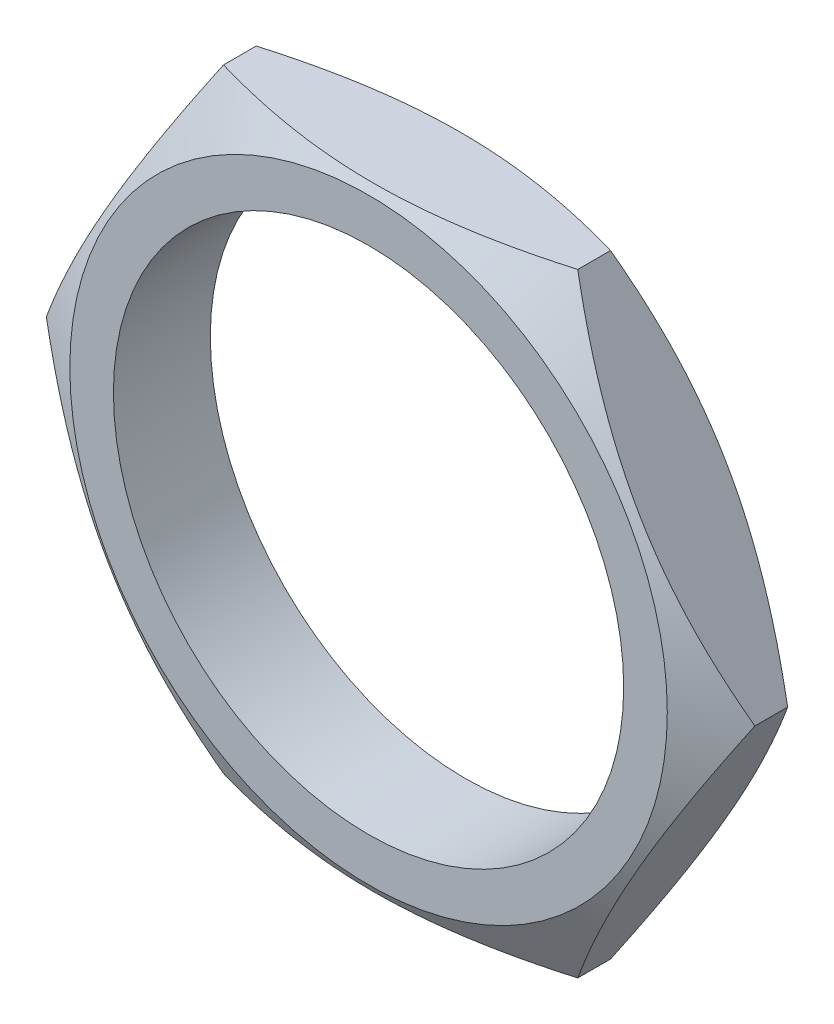
ISO-10303-21;
HEADER;
FILE_DESCRIPTION(('STEP AP214'),'2;1');
FILE_NAME('part.step','',(''),(''),'','','');
FILE_SCHEMA(('AUTOMOTIVE_DESIGN { 1 0 10303 214 1 1 1 1 }'));
ENDSEC;
DATA;
#1=APPLICATION_CONTEXT('core data for automotive mechanical design processes');
#2=APPLICATION_PROTOCOL_DEFINITION('international standard','automotive_design',2000,#1);
#3=PRODUCT_CONTEXT('',#1,'mechanical');
#4=PRODUCT('Part','Part','',(#3));
#5=PRODUCT_RELATED_PRODUCT_CATEGORY('part','',(#4));
#6=PRODUCT_DEFINITION_FORMATION('','',#4);
#7=PRODUCT_DEFINITION_CONTEXT('part definition',#1,'design');
#8=PRODUCT_DEFINITION('design','',#6,#7);
#9=PRODUCT_DEFINITION_SHAPE('','',#8);
#10=(LENGTH_UNIT() NAMED_UNIT(*) SI_UNIT(.MILLI.,.METRE.));
#11=(NAMED_UNIT(*) PLANE_ANGLE_UNIT() SI_UNIT($,.RADIAN.));
#12=(NAMED_UNIT(*) SI_UNIT($,.STERADIAN.) SOLID_ANGLE_UNIT());
#13=UNCERTAINTY_MEASURE_WITH_UNIT(LENGTH_MEASURE(1.E-05),#10,'distance_accuracy_value','');
#14=(GEOMETRIC_REPRESENTATION_CONTEXT(3) GLOBAL_UNCERTAINTY_ASSIGNED_CONTEXT((#13)) GLOBAL_UNIT_ASSIGNED_CONTEXT((#10,
#11,#12)) REPRESENTATION_CONTEXT('',''));
#15=CARTESIAN_POINT('',(0.,0.,0.));
#16=DIRECTION('',(0.,0.,1.));
#17=DIRECTION('',(1.,0.,0.));
#18=AXIS2_PLACEMENT_3D('',#15,#16,#17);
#19=CARTESIAN_POINT('',(5.48482755730136,9.50000000000006,1.5));
#20=DIRECTION('',(0.,-1.,0.));
#21=DIRECTION('',(1.,0.,0.));
#22=AXIS2_PLACEMENT_3D('',#19,#20,#21);
#23=PLANE('',#22);
#24=CARTESIAN_POINT('',(-5.48482747069538,9.49999999999994,-0.507156681671752));
#25=CARTESIAN_POINT('',(-5.24369241217304,9.49999999999994,-0.576752926627082));
#26=CARTESIAN_POINT('',(-5.00165827848154,9.49999999999995,-0.643190232697004));
#27=CARTESIAN_POINT('',(-4.5156491006031,9.49999999999995,-0.768870484568428));
#28=CARTESIAN_POINT('',(-4.27167344600815,9.49999999999995,-0.828111064169221));
#29=CARTESIAN_POINT('',(-3.5358154853058,9.49999999999996,-0.993891189251453));
#30=CARTESIAN_POINT('',(-3.04102834589159,9.49999999999997,-1.08818506270426));
#31=CARTESIAN_POINT('',(-2.30060208487663,9.49999999999998,-1.19875147244339));
#32=CARTESIAN_POINT('',(-2.05717488713435,9.49999999999998,-1.2302473008193));
#33=CARTESIAN_POINT('',(-1.56919354672236,9.49999999999998,-1.28306285329731));
#34=CARTESIAN_POINT('',(-1.32463938245008,9.49999999999999,-1.30438238150603));
#35=CARTESIAN_POINT('',(-0.835123219481101,9.49999999999999,-1.33629907616487));
#36=CARTESIAN_POINT('',(-0.590162053474965,9.49999999999999,-1.34690898339971));
#37=CARTESIAN_POINT('',(-0.100013578709532,9.5,-1.35718099378027));
#38=CARTESIAN_POINT('',(0.145173722826755,9.5,-1.35684343526236));
#39=CARTESIAN_POINT('',(0.603542324034616,9.50000000000001,-1.34598288198209));
#40=CARTESIAN_POINT('',(0.816756005152166,9.50000000000001,-1.33678473937644));
#41=CARTESIAN_POINT('',(1.24268468603248,9.50000000000001,-1.31028846872389));
#42=CARTESIAN_POINT('',(1.45539964945816,9.50000000000002,-1.29298976783103));
#43=CARTESIAN_POINT('',(2.09272028031947,9.50000000000002,-1.22935175402461));
#44=CARTESIAN_POINT('',(2.51619788692956,9.50000000000003,-1.17127845934866));
#45=CARTESIAN_POINT('',(3.36764458045082,9.50000000000004,-1.02609722813325));
#46=CARTESIAN_POINT('',(3.79550502607017,9.50000000000004,-0.938373999348496));
#47=CARTESIAN_POINT('',(4.644846159175,9.50000000000005,-0.739279671614696));
#48=CARTESIAN_POINT('',(5.06633771943659,9.50000000000005,-0.627955321332633));
#49=CARTESIAN_POINT('',(5.48482747069519,9.50000000000006,-0.50715668167175));
#50=B_SPLINE_CURVE_WITH_KNOTS('',3,(#24,#25,#26,#27,#28,#29,#30,#31,#32,#33,#34,#35,#36,#37,#38,
#39,#40,#41,#42,#43,#44,#45,#46,#47,#48,#49),.UNSPECIFIED.,.F.,.F.,(4,2,2,2,2,2,2,2,2,2,2,2,4),
(0.,0.752872599265493,1.50599206823814,3.01543663812971,3.75163414868368,4.48784583043896,
5.22318063625757,5.95849271624439,6.59856919664444,7.23869094807523,8.51984386262599,
9.82940660837379,11.1363992354911),.UNSPECIFIED.);
#51=CARTESIAN_POINT('',(-5.48482754897384,9.50000001442397,-0.507156651862693));
#52=VERTEX_POINT('',#51);
#53=CARTESIAN_POINT('',(5.48482751399828,9.50000000000006,-0.507156669171226));
#54=VERTEX_POINT('',#53);
#55=EDGE_CURVE('E171',#52,#54,#50,.T.);
#56=ORIENTED_EDGE('',*,*,#55,.F.);
#57=DIRECTION('',(0.,0.,1.));
#58=VECTOR('',#57,1.);
#59=CARTESIAN_POINT('',(-5.48482755730156,9.49999999999994,1.5));
#60=LINE('',#59,#58);
#61=CARTESIAN_POINT('',(-5.484827573957,9.49999999999994,0.507156651862692));
#62=VERTEX_POINT('',#61);
#63=EDGE_CURVE('E73',#52,#62,#60,.T.);
#64=ORIENTED_EDGE('',*,*,#63,.T.);
#65=CARTESIAN_POINT('',(5.48482759061223,9.50000000000006,0.507156647054684));
#66=CARTESIAN_POINT('',(5.24369253108016,9.50000000000006,0.57675289344235));
#67=CARTESIAN_POINT('',(5.00165839637397,9.50000000000005,0.643190200979248));
#68=CARTESIAN_POINT('',(4.5156492164453,9.50000000000005,0.768870455848148));
#69=CARTESIAN_POINT('',(4.2716735608148,9.50000000000004,0.828111036979457));
#70=CARTESIAN_POINT('',(3.53581559688714,9.50000000000004,0.993891166760253));
#71=CARTESIAN_POINT('',(3.04102845523562,9.50000000000003,1.08818504346215));
#72=CARTESIAN_POINT('',(2.30060219085026,9.50000000000002,1.19875145804262));
#73=CARTESIAN_POINT('',(2.05717499206478,9.50000000000002,1.23024728800195));
#74=CARTESIAN_POINT('',(1.56919364950412,9.50000000000002,1.28306284363182));
#75=CARTESIAN_POINT('',(1.32463948412638,9.50000000000001,1.304382373409));
#76=CARTESIAN_POINT('',(0.835123318892476,9.50000000000001,1.33629907114926));
#77=CARTESIAN_POINT('',(0.590162151726997,9.50000000000001,1.3469089798977));
#78=CARTESIAN_POINT('',(0.100013674575482,9.5,1.35718099321387));
#79=CARTESIAN_POINT('',(-0.145173628187543,9.5,1.35684343611792));
#80=CARTESIAN_POINT('',(-0.60354223952882,9.49999999999999,1.34598288519186));
#81=CARTESIAN_POINT('',(-0.816755929538221,9.49999999999999,1.33678474323182));
#82=CARTESIAN_POINT('',(-1.24268462819186,9.49999999999999,1.31028847317148));
#83=CARTESIAN_POINT('',(-1.455399600499,9.49999999999998,1.29298977222508));
#84=CARTESIAN_POINT('',(-2.09272025799012,9.49999999999998,1.22935175724135));
#85=CARTESIAN_POINT('',(-2.51619788227956,9.49999999999997,1.17127846042461));
#86=CARTESIAN_POINT('',(-3.3676446116581,9.49999999999996,1.02609722252197));
#87=CARTESIAN_POINT('',(-3.79550507543951,9.49999999999996,0.938373989104679));
#88=CARTESIAN_POINT('',(-4.64484624425223,9.49999999999995,0.739279650345785));
#89=CARTESIAN_POINT('',(-5.06633782206185,9.49999999999995,0.627955293679904));
#90=CARTESIAN_POINT('',(-5.48482759061243,9.49999999999994,0.507156647054682));
#91=B_SPLINE_CURVE_WITH_KNOTS('',3,(#65,#66,#67,#68,#69,#70,#71,#72,#73,#74,#75,#76,#77,#78,#79,
#80,#81,#82,#83,#84,#85,#86,#87,#88,#89,#90),.UNSPECIFIED.,.F.,.F.,(4,2,2,2,2,2,2,2,2,2,2,2,4),
(0.,0.752872603368095,1.50599207644524,3.01543665477214,3.75163416903957,4.48784585450709,
5.22318066399448,5.95849274765322,6.5985692545986,7.23869103258221,8.51984400040111,
9.82940680223509,11.136399485041),.UNSPECIFIED.);
#92=CARTESIAN_POINT('',(5.4848275789529,9.49999996249849,0.507156669171226));
#93=VERTEX_POINT('',#92);
#94=EDGE_CURVE('E95',#93,#62,#91,.T.);
#95=ORIENTED_EDGE('',*,*,#94,.F.);
#96=DIRECTION('',(0.,0.,1.));
#97=VECTOR('',#96,1.);
#98=CARTESIAN_POINT('',(5.48482755730136,9.50000000000006,1.5));
#99=LINE('',#98,#97);
#100=EDGE_CURVE('E181',#93,#54,#99,.F.);
#101=ORIENTED_EDGE('',*,*,#100,.T.);
#102=EDGE_LOOP('',(#56,#64,#95,#101));
#103=FACE_BOUND('',#102,.T.);
#104=ADVANCED_FACE('F16',(#103),#23,.F.);
#105=CARTESIAN_POINT('',(10.9696551146029,0.,1.5));
#106=DIRECTION('',(-0.866025403784435,-0.500000000000007,0.));
#107=DIRECTION('',(0.500000000000007,-0.866025403784435,0.));
#108=AXIS2_PLACEMENT_3D('',#105,#106,#107);
#109=PLANE('',#108);
#110=CARTESIAN_POINT('',(5.48482754064593,9.50000002884811,-0.507156647054687));
#111=CARTESIAN_POINT('',(5.60539507040686,9.29117094155911,-0.576752893439408));
#112=CARTESIAN_POINT('',(5.72641213775481,9.08156323232947,-0.643190200973625));
#113=CARTESIAN_POINT('',(5.9694167277088,8.66066693605674,-0.768870455837818));
#114=CARTESIAN_POINT('',(6.09140455551883,8.4493778203848,-0.828111036967099));
#115=CARTESIAN_POINT('',(6.45933353746556,7.81210613007598,-0.993891166742363));
#116=CARTESIAN_POINT('',(6.70672710827929,7.38360789596072,-1.08818504344209));
#117=CARTESIAN_POINT('',(7.07694024046505,6.74237994138579,-1.19875145802592));
#118=CARTESIAN_POINT('',(7.19865383986302,6.53156580325643,-1.23024728798824));
#119=CARTESIAN_POINT('',(7.44264451115394,6.10896156400772,-1.28306284362329));
#120=CARTESIAN_POINT('',(7.56492159384818,5.89717144418,-1.30438237340266));
#121=CARTESIAN_POINT('',(7.80967967647648,5.47323800950465,-1.33629907114647));
#122=CARTESIAN_POINT('',(7.9321602600652,5.26109541578831,-1.34690897989622));
#123=CARTESIAN_POINT('',(8.1772344986528,4.83661438292833,-1.35718099321388));
#124=CARTESIAN_POINT('',(8.29982815004018,4.62427595004,-1.35684343611812));
#125=CARTESIAN_POINT('',(8.5290124543876,4.22731709061296,-1.3459828852549));
#126=CARTESIAN_POINT('',(8.63561929806452,4.04266862092998,-1.33678474346124));
#127=CARTESIAN_POINT('',(8.84858364474375,3.67380355228085,-1.31028847393264));
#128=CARTESIAN_POINT('',(8.95494112957752,3.48958698478352,-1.29298977335164));
#129=CARTESIAN_POINT('',(9.27360145437445,2.93765111187886,-1.2293517597445));
#130=CARTESIAN_POINT('',(9.48534026390916,2.57090873583059,-1.17127846421897));
#131=CARTESIAN_POINT('',(9.91106362331898,1.8335342473639,-1.02609722953676));
#132=CARTESIAN_POINT('',(10.1249938525429,1.46299622107329,-0.938373998072029));
#133=CARTESIAN_POINT('',(10.5496644317126,0.727445201471602,-0.739279663642889));
#134=CARTESIAN_POINT('',(10.7604102180473,0.362422792058908,-0.627955309351615));
#135=CARTESIAN_POINT('',(10.969655099788,2.56603099533638E-08,-0.507156665224113));
#136=B_SPLINE_CURVE_WITH_KNOTS('',3,(#110,#111,#112,#113,#114,#115,#116,#117,#118,#119,#120,
#121,#122,#123,#124,#125,#126,#127,#128,#129,#130,#131,#132,#133,#134,#135),.UNSPECIFIED.,.F.,
.F.,(4,2,2,2,2,2,2,2,2,2,2,2,4),(0.,0.75287260333622,1.50599207638153,3.01543665463657,
3.75163416893623,4.48784585443635,5.22318066395982,5.95849274765325,6.59856924662416,
7.23869101663088,8.51984396844788,9.82940675344899,11.1363994195502),.UNSPECIFIED.);
#137=CARTESIAN_POINT('',(10.969655107941,1.15388380827717E-08,-0.507156660516956));
#138=VERTEX_POINT('',#137);
#139=EDGE_CURVE('E161',#54,#138,#136,.T.);
#140=ORIENTED_EDGE('',*,*,#139,.F.);
#141=ORIENTED_EDGE('',*,*,#100,.F.);
#142=CARTESIAN_POINT('',(10.9696551312577,-2.88468719590957E-08,0.507156647055052));
#143=CARTESIAN_POINT('',(10.8490876015014,0.208829058434115,0.576752893437092));
#144=CARTESIAN_POINT('',(10.7280705341581,0.418436767655674,0.643190200968868));
#145=CARTESIAN_POINT('',(10.4850659442135,0.839333063912144,0.768870455828769));
#146=CARTESIAN_POINT('',(10.3630781164082,1.05062217957591,0.828111036956199));
#147=CARTESIAN_POINT('',(9.99514913447696,1.68789386985788,0.993891166726406));
#148=CARTESIAN_POINT('',(9.74775556367413,2.11639210395425,1.08818504342413));
#149=CARTESIAN_POINT('',(9.37754243149467,2.75762005851828,1.19875145801096));
#150=CARTESIAN_POINT('',(9.25582883209198,2.96843419665583,1.23024728797597));
#151=CARTESIAN_POINT('',(9.01183816079148,3.39103843592112,1.28306284361567));
#152=CARTESIAN_POINT('',(8.88956107809238,3.60282855575725,1.304382373397));
#153=CARTESIAN_POINT('',(8.64480299545383,4.02676199045036,1.33629907114399));
#154=CARTESIAN_POINT('',(8.52232241185971,4.23890458417606,1.34690897989493));
#155=CARTESIAN_POINT('',(8.27724817326139,4.66338561705459,1.35718099321389));
#156=CARTESIAN_POINT('',(8.15465452186871,4.87572404995211,1.35684343611829));
#157=CARTESIAN_POINT('',(7.92547021871916,5.27268290730439,1.34598288531193));
#158=CARTESIAN_POINT('',(7.81886337624421,5.45733137490549,1.33678474366888));
#159=CARTESIAN_POINT('',(7.60589903196171,5.82619643940336,1.31028847462161));
#160=CARTESIAN_POINT('',(7.49954154832269,6.01041300483131,1.29298977437136));
#161=CARTESIAN_POINT('',(7.18088122710028,6.56234887154473,1.22935176201037));
#162=CARTESIAN_POINT('',(6.96914241992829,6.92909124350065,1.17127846765367));
#163=CARTESIAN_POINT('',(6.54341906529771,7.66646572368946,1.02609723588672));
#164=CARTESIAN_POINT('',(6.32948883848799,8.03700374579862,0.938374006189533));
#165=CARTESIAN_POINT('',(5.90481826405871,8.77255475718959,0.739279675679875));
#166=CARTESIAN_POINT('',(5.69407248005067,9.13757716257244,0.627955323538201));
#167=CARTESIAN_POINT('',(5.48482760060444,9.49999992499692,0.50715668167175));
#168=B_SPLINE_CURVE_WITH_KNOTS('',3,(#142,#143,#144,#145,#146,#147,#148,#149,#150,#151,#152,
#153,#154,#155,#156,#157,#158,#159,#160,#161,#162,#163,#164,#165,#166,#167),.UNSPECIFIED.,.F.,
.F.,(4,2,2,2,2,2,2,2,2,2,2,2,4),(0.,0.752872603307322,1.50599207632378,3.01543665451368,
3.75163416884247,4.48784585437206,5.22318066392816,5.95849274765295,6.59856923940496,
7.23869100219059,8.51984393952184,9.82940670928497,11.1363993602642),.UNSPECIFIED.);
#169=CARTESIAN_POINT('',(10.9696550929517,-3.75009393397416E-08,0.507156669171041));
#170=VERTEX_POINT('',#169);
#171=EDGE_CURVE('E132',#170,#93,#168,.T.);
#172=ORIENTED_EDGE('',*,*,#171,.F.);
#173=DIRECTION('',(0.,0.,1.));
#174=VECTOR('',#173,1.);
#175=CARTESIAN_POINT('',(10.9696551146029,0.,1.5));
#176=LINE('',#175,#174);
#177=EDGE_CURVE('E183',#170,#138,#176,.F.);
#178=ORIENTED_EDGE('',*,*,#177,.T.);
#179=EDGE_LOOP('',(#140,#141,#172,#178));
#180=FACE_BOUND('',#179,.T.);
#181=ADVANCED_FACE('F147',(#180),#109,.F.);
#182=CARTESIAN_POINT('',(5.48482755730149,-9.49999999999998,1.5));
#183=DIRECTION('',(-0.866025403784442,0.499999999999995,0.));
#184=DIRECTION('',(-0.499999999999995,-0.866025403784442,0.));
#185=AXIS2_PLACEMENT_3D('',#182,#183,#184);
#186=PLANE('',#185);
#187=CARTESIAN_POINT('',(10.9696550834051,-1.65351525326006E-08,-0.507156653031569));
#188=CARTESIAN_POINT('',(10.8490875648531,-0.208829108110526,-0.576752906056447));
#189=CARTESIAN_POINT('',(10.7280705022233,-0.418436819193157,-0.643190216049517));
#190=CARTESIAN_POINT('',(10.4850659158023,-0.839333116897993,-0.768870471956749));
#191=CARTESIAN_POINT('',(10.3630780868054,-1.05062223214796,-0.82811105167058));
#192=CARTESIAN_POINT('',(9.99514910305792,-1.68789392167443,-0.993891178129983));
#193=CARTESIAN_POINT('',(9.74775553332507,-2.11639215605143,-1.08818505391583));
#194=CARTESIAN_POINT('',(9.3775424016209,-2.75762011048978,-1.19875146623498));
#195=CARTESIAN_POINT('',(9.25582880220591,-2.96843424848123,-1.23024729530939));
#196=CARTESIAN_POINT('',(9.01183813100399,-3.39103848745326,-1.28306284920042));
#197=CARTESIAN_POINT('',(8.88956104841579,-3.60282860714217,-1.30438237812422));
#198=CARTESIAN_POINT('',(8.64480296597318,-4.0267620415287,-1.33629907413188));
#199=CARTESIAN_POINT('',(8.52232238246406,-4.23890463509518,-1.34690898199951));
#200=CARTESIAN_POINT('',(8.27724814405992,-4.66338566762865,-1.35718099356552));
#201=CARTESIAN_POINT('',(8.15465449277642,-4.87572410034034,-1.35684343560003));
#202=CARTESIAN_POINT('',(7.9254701909406,-5.27268295541924,-1.34598288324645));
#203=CARTESIAN_POINT('',(7.81886334966708,-5.45733142093871,-1.3367847410074));
#204=CARTESIAN_POINT('',(7.60589900779393,-5.82619648126295,-1.31028847096884));
#205=CARTESIAN_POINT('',(7.49954152536285,-6.01041304459887,-1.29298977032333));
#206=CARTESIAN_POINT('',(7.18088120778685,-6.56234890499682,-1.22935175708143));
#207=CARTESIAN_POINT('',(6.9691424030538,-6.92909127272825,-1.17127846254392));
#208=CARTESIAN_POINT('',(6.54341905332327,-7.66646574442984,-1.02609723114216));
#209=CARTESIAN_POINT('',(6.32948882897352,-8.03700376227824,-0.938374002008733));
#210=CARTESIAN_POINT('',(5.90481825936767,-8.77255476531485,-0.739279673201333));
#211=CARTESIAN_POINT('',(5.69407247772362,-9.13757716660321,-0.627955322193485));
#212=CARTESIAN_POINT('',(5.48482760060457,-9.49999992499685,-0.507156681671747));
#213=B_SPLINE_CURVE_WITH_KNOTS('',3,(#187,#188,#189,#190,#191,#192,#193,#194,#195,#196,#197,
#198,#199,#200,#201,#202,#203,#204,#205,#206,#207,#208,#209,#210,#211,#212),.UNSPECIFIED.,.F.,
.F.,(4,2,2,2,2,2,2,2,2,2,2,2,4),(0.,0.752872603099222,1.50599207573759,3.01543665269343,
3.75163416629829,4.48784585106415,5.22318065996227,5.9584927430452,6.59856922767672,
7.23869098334017,8.51984390629456,9.82940666128699,11.1363992977175),.UNSPECIFIED.);
#214=CARTESIAN_POINT('',(5.48482757895303,-9.49999996249841,-0.507156669171225));
#215=VERTEX_POINT('',#214);
#216=EDGE_CURVE('E153',#138,#215,#213,.T.);
#217=ORIENTED_EDGE('',*,*,#216,.F.);
#218=ORIENTED_EDGE('',*,*,#177,.F.);
#219=CARTESIAN_POINT('',(5.48482751144009,-9.50000000443143,0.507156624391121));
#220=CARTESIAN_POINT('',(5.60539506033417,-9.2911709314051,0.576752885485714));
#221=CARTESIAN_POINT('',(5.72641213611202,-9.08156322762475,0.643190199402005));
#222=CARTESIAN_POINT('',(5.9694167330943,-8.66066693428164,0.768870459345104));
#223=CARTESIAN_POINT('',(6.0914045594991,-8.44937781608812,0.828111039171957));
#224=CARTESIAN_POINT('',(6.45933353988554,-7.81210612067904,0.993891167008512));
#225=CARTESIAN_POINT('',(6.70672711334014,-7.38360788625744,1.08818504512742));
#226=CARTESIAN_POINT('',(7.07694024744918,-6.74237992974633,1.19875146002658));
#227=CARTESIAN_POINT('',(7.19865384711807,-6.5315657908129,1.2302472897995));
#228=CARTESIAN_POINT('',(7.44264451910369,-6.10896155011584,1.28306284510355));
#229=CARTESIAN_POINT('',(7.56492160222165,-5.89717142964395,1.30438237474243));
#230=CARTESIAN_POINT('',(7.80967968567919,-5.47323799359788,1.3362990720989));
#231=CARTESIAN_POINT('',(7.93216026967357,-5.26109539915488,1.34690898059932));
#232=CARTESIAN_POINT('',(8.17723450908399,-4.83661436485225,1.35718099335078));
#233=CARTESIAN_POINT('',(8.29982816088853,-4.62427593124792,1.35684343593769));
#234=CARTESIAN_POINT('',(8.52901246395983,-4.22731707403526,1.34598288451079));
#235=CARTESIAN_POINT('',(8.63561930594692,-4.04266860727777,1.33678474263834));
#236=CARTESIAN_POINT('',(8.84858364925219,-3.67380354447145,1.31028847321375));
#237=CARTESIAN_POINT('',(8.95494113240183,-3.48958697989145,1.29298977281558));
#238=CARTESIAN_POINT('',(9.27360145212372,-2.93765111577754,1.22935176013819));
#239=CARTESIAN_POINT('',(9.4853402582846,-2.57090874557266,1.17127846573909));
#240=CARTESIAN_POINT('',(9.91106361098493,-1.83353426872689,1.0260972341509));
#241=CARTESIAN_POINT('',(10.1249938368748,-1.46299624821094,0.938374004668774));
#242=CARTESIAN_POINT('',(10.5496644095343,-0.727445239885461,0.739279674787693));
#243=CARTESIAN_POINT('',(10.7604101926917,-0.362422835975979,0.627955323054018));
#244=CARTESIAN_POINT('',(10.9696550713005,-7.50019564648352E-08,0.50715668167138));
#245=B_SPLINE_CURVE_WITH_KNOTS('',3,(#219,#220,#221,#222,#223,#224,#225,#226,#227,#228,#229,
#230,#231,#232,#233,#234,#235,#236,#237,#238,#239,#240,#241,#242,#243,#244),.UNSPECIFIED.,.F.,
.F.,(4,2,2,2,2,2,2,2,2,2,2,2,4),(0.,0.752872606932993,1.50599208323712,3.0154366672573,
3.75163418391308,4.48784587168956,5.2231806836672,5.95849276984627,6.59856925870939,
7.23869101860563,8.5198439499639,9.82940671420126,11.1363993599453),.UNSPECIFIED.);
#246=CARTESIAN_POINT('',(5.48482751399841,-9.49999999999998,0.507156669171225));
#247=VERTEX_POINT('',#246);
#248=EDGE_CURVE('E99',#247,#170,#245,.T.);
#249=ORIENTED_EDGE('',*,*,#248,.F.);
#250=DIRECTION('',(0.,0.,1.));
#251=VECTOR('',#250,1.);
#252=CARTESIAN_POINT('',(5.48482755730149,-9.49999999999998,1.5));
#253=LINE('',#252,#251);
#254=EDGE_CURVE('E189',#247,#215,#253,.F.);
#255=ORIENTED_EDGE('',*,*,#254,.T.);
#256=EDGE_LOOP('',(#217,#218,#249,#255));
#257=FACE_BOUND('',#256,.T.);
#258=ADVANCED_FACE('F143',(#257),#186,.F.);
#259=CARTESIAN_POINT('',(-5.48482755730143,-9.50000000000002,1.5));
#260=DIRECTION('',(0.,1.,0.));
#261=DIRECTION('',(-1.,0.,0.));
#262=AXIS2_PLACEMENT_3D('',#259,#260,#261);
#263=PLANE('',#262);
#264=CARTESIAN_POINT('',(5.48482759061236,-9.49999999999998,-0.507156647054683));
#265=CARTESIAN_POINT('',(5.24369253109974,-9.49999999999998,-0.576752893436738));
#266=CARTESIAN_POINT('',(5.00165839641315,-9.49999999999998,-0.64319020096853));
#267=CARTESIAN_POINT('',(4.51564921652395,-9.49999999999999,-0.768870455828463));
#268=CARTESIAN_POINT('',(4.27167356091332,-9.49999999999999,-0.828111036955909));
#269=CARTESIAN_POINT('',(3.53581559705083,-9.49999999999999,-0.993891166726165));
#270=CARTESIAN_POINT('',(3.04102845544516,-9.49999999999999,-1.08818504342392));
#271=CARTESIAN_POINT('',(2.30060219108622,-9.49999999999999,-1.1987514580108));
#272=CARTESIAN_POINT('',(2.05717499228082,-9.49999999999999,-1.23024728797583));
#273=CARTESIAN_POINT('',(1.5691936496798,-9.5,-1.28306284361557));
#274=CARTESIAN_POINT('',(1.32463948428161,-9.5,-1.30438237339691));
#275=CARTESIAN_POINT('',(0.835123319004479,-9.5,-1.33629907114394));
#276=CARTESIAN_POINT('',(0.590162151816226,-9.5,-1.34690897989489));
#277=CARTESIAN_POINT('',(0.100013674619581,-9.5,-1.35718099321389));
#278=CARTESIAN_POINT('',(-0.145173628165799,-9.5,-1.35684343611829));
#279=CARTESIAN_POINT('',(-0.603542234464953,-9.50000000000001,-1.34598288531196));
#280=CARTESIAN_POINT('',(-0.816755919414884,-9.50000000000001,-1.33678474366893));
#281=CARTESIAN_POINT('',(-1.24268460797996,-9.50000000000001,-1.31028847462168));
#282=CARTESIAN_POINT('',(-1.45539957525803,-9.50000000000001,-1.29298977437143));
#283=CARTESIAN_POINT('',(-2.09272021770297,-9.50000000000001,-1.22935176201045));
#284=CARTESIAN_POINT('',(-2.51619783204703,-9.50000000000001,-1.17127846765376));
#285=CARTESIAN_POINT('',(-3.36764454130834,-9.50000000000001,-1.0260972358868));
#286=CARTESIAN_POINT('',(-3.79550499492786,-9.50000000000001,-0.938374006189605));
#287=CARTESIAN_POINT('',(-4.64484614378658,-9.50000000000002,-0.739279675679917));
#288=CARTESIAN_POINT('',(-5.06633771180274,-9.50000000000002,-0.627955323538223));
#289=CARTESIAN_POINT('',(-5.48482747069526,-9.50000000000002,-0.50715668167175));
#290=B_SPLINE_CURVE_WITH_KNOTS('',3,(#264,#265,#266,#267,#268,#269,#270,#271,#272,#273,#274,
#275,#276,#277,#278,#279,#280,#281,#282,#283,#284,#285,#286,#287,#288,#289),.UNSPECIFIED.,.F.,
.F.,(4,2,2,2,2,2,2,2,2,2,2,2,4),(0.,0.752872603307366,1.50599207632387,3.01543665451386,
3.75163416884269,4.48784585437231,5.22318066392846,5.95849274765328,6.59856923940541,
7.23869100219116,8.51984393952266,9.82940670928604,11.1363993602655),.UNSPECIFIED.);
#291=CARTESIAN_POINT('',(-5.48482751399834,-9.50000000000002,-0.507156669171226));
#292=VERTEX_POINT('',#291);
#293=EDGE_CURVE('E160',#215,#292,#290,.T.);
#294=ORIENTED_EDGE('',*,*,#293,.F.);
#295=ORIENTED_EDGE('',*,*,#254,.F.);
#296=CARTESIAN_POINT('',(-5.48482759061229,-9.50000000000002,0.507156647054683));
#297=CARTESIAN_POINT('',(-5.24369253109968,-9.50000000000002,0.576752893436738));
#298=CARTESIAN_POINT('',(-5.00165839641309,-9.50000000000002,0.643190200968529));
#299=CARTESIAN_POINT('',(-4.51564921652389,-9.50000000000002,0.768870455828461));
#300=CARTESIAN_POINT('',(-4.27167356091325,-9.50000000000002,0.828111036955907));
#301=CARTESIAN_POINT('',(-3.53581559705077,-9.50000000000001,0.993891166726164));
#302=CARTESIAN_POINT('',(-3.0410284554451,-9.50000000000001,1.08818504342392));
#303=CARTESIAN_POINT('',(-2.30060219108615,-9.50000000000001,1.1987514580108));
#304=CARTESIAN_POINT('',(-2.05717499228076,-9.50000000000001,1.23024728797583));
#305=CARTESIAN_POINT('',(-1.56919364967974,-9.50000000000001,1.28306284361557));
#306=CARTESIAN_POINT('',(-1.32463948428154,-9.50000000000001,1.30438237339691));
#307=CARTESIAN_POINT('',(-0.835123319004416,-9.50000000000001,1.33629907114394));
#308=CARTESIAN_POINT('',(-0.590162151816163,-9.5,1.34690897989489));
#309=CARTESIAN_POINT('',(-0.100013674619518,-9.5,1.35718099321389));
#310=CARTESIAN_POINT('',(0.145173628165862,-9.5,1.35684343611829));
#311=CARTESIAN_POINT('',(0.603542234465017,-9.5,1.34598288531196));
#312=CARTESIAN_POINT('',(0.816755919414948,-9.5,1.33678474366893));
#313=CARTESIAN_POINT('',(1.24268460798003,-9.5,1.31028847462168));
#314=CARTESIAN_POINT('',(1.4553995752581,-9.5,1.29298977437143));
#315=CARTESIAN_POINT('',(2.09272021770303,-9.49999999999999,1.22935176201045));
#316=CARTESIAN_POINT('',(2.5161978320471,-9.49999999999999,1.17127846765376));
#317=CARTESIAN_POINT('',(3.3676445413084,-9.49999999999999,1.0260972358868));
#318=CARTESIAN_POINT('',(3.79550499492793,-9.49999999999999,0.938374006189604));
#319=CARTESIAN_POINT('',(4.64484614378665,-9.49999999999999,0.739279675679917));
#320=CARTESIAN_POINT('',(5.06633771180281,-9.49999999999999,0.627955323538223));
#321=CARTESIAN_POINT('',(5.48482747069533,-9.49999999999998,0.507156681671749));
#322=B_SPLINE_CURVE_WITH_KNOTS('',3,(#296,#297,#298,#299,#300,#301,#302,#303,#304,#305,#306,
#307,#308,#309,#310,#311,#312,#313,#314,#315,#316,#317,#318,#319,#320,#321),.UNSPECIFIED.,.F.,
.F.,(4,2,2,2,2,2,2,2,2,2,2,2,4),(0.,0.752872603307365,1.50599207632387,3.01543665451386,
3.75163416884269,4.48784585437231,5.22318066392846,5.95849274765328,6.59856923940541,
7.23869100219117,8.51984393952266,9.82940670928605,11.1363993602655),.UNSPECIFIED.);
#323=CARTESIAN_POINT('',(-5.48482757895297,-9.49999996249845,0.507156669171226));
#324=VERTEX_POINT('',#323);
#325=EDGE_CURVE('E98',#324,#247,#322,.T.);
#326=ORIENTED_EDGE('',*,*,#325,.F.);
#327=DIRECTION('',(0.,0.,1.));
#328=VECTOR('',#327,1.);
#329=CARTESIAN_POINT('',(-5.48482755730143,-9.50000000000002,1.5));
#330=LINE('',#329,#328);
#331=EDGE_CURVE('E85',#324,#292,#330,.F.);
#332=ORIENTED_EDGE('',*,*,#331,.T.);
#333=EDGE_LOOP('',(#294,#295,#326,#332));
#334=FACE_BOUND('',#333,.T.);
#335=ADVANCED_FACE('F146',(#334),#263,.F.);
#336=CARTESIAN_POINT('',(-10.9696551146029,0.,1.5));
#337=DIRECTION('',(0.866025403784438,0.500000000000001,0.));
#338=DIRECTION('',(-0.500000000000001,0.866025403784438,0.));
#339=AXIS2_PLACEMENT_3D('',#336,#337,#338);
#340=PLANE('',#339);
#341=CARTESIAN_POINT('',(-5.48482751144002,-9.50000000443148,-0.507156624391116));
#342=CARTESIAN_POINT('',(-5.6053950603341,-9.29117093140515,-0.576752885485709));
#343=CARTESIAN_POINT('',(-5.72641213611196,-9.08156322762479,-0.643190199402001));
#344=CARTESIAN_POINT('',(-5.96941673309423,-8.66066693428169,-0.7688704593451));
#345=CARTESIAN_POINT('',(-6.09140455949904,-8.44937781608817,-0.828111039171954));
#346=CARTESIAN_POINT('',(-6.45933353988548,-7.8121061206791,-0.99389116700851));
#347=CARTESIAN_POINT('',(-6.70672711334009,-7.3836078862575,-1.08818504512742));
#348=CARTESIAN_POINT('',(-7.07694024744913,-6.74237992974639,-1.19875146002658));
#349=CARTESIAN_POINT('',(-7.19865384711802,-6.53156579081296,-1.23024728979949));
#350=CARTESIAN_POINT('',(-7.44264451910365,-6.1089615501159,-1.28306284510354));
#351=CARTESIAN_POINT('',(-7.56492160222161,-5.89717142964401,-1.30438237474242));
#352=CARTESIAN_POINT('',(-7.80967968567915,-5.47323799359794,-1.3362990720989));
#353=CARTESIAN_POINT('',(-7.93216026967353,-5.26109539915494,-1.34690898059932));
#354=CARTESIAN_POINT('',(-8.17723450908395,-4.83661436485231,-1.35718099335078));
#355=CARTESIAN_POINT('',(-8.2998281608885,-4.62427593124798,-1.35684343593769));
#356=CARTESIAN_POINT('',(-8.52901246395977,-4.22731707403537,-1.34598288451079));
#357=CARTESIAN_POINT('',(-8.63561930594683,-4.04266860727793,-1.33678474263835));
#358=CARTESIAN_POINT('',(-8.84858364925205,-3.6738035444717,-1.31028847321377));
#359=CARTESIAN_POINT('',(-8.95494113240167,-3.48958697989175,-1.29298977281561));
#360=CARTESIAN_POINT('',(-9.27360145212348,-2.93765111577798,-1.22935176013824));
#361=CARTESIAN_POINT('',(-9.48534025828431,-2.5709087455732,-1.17127846573917));
#362=CARTESIAN_POINT('',(-9.91106361098454,-1.83353426872762,-1.02609723415104));
#363=CARTESIAN_POINT('',(-10.1249938368744,-1.46299624821176,-0.938374004668957));
#364=CARTESIAN_POINT('',(-10.5496644095338,-0.727445239886473,-0.739279674787965));
#365=CARTESIAN_POINT('',(-10.7604101926911,-0.362422835977083,-0.627955323054339));
#366=CARTESIAN_POINT('',(-10.9696550712998,-7.50031514996553E-08,-0.507156681671752));
#367=B_SPLINE_CURVE_WITH_KNOTS('',3,(#341,#342,#343,#344,#345,#346,#347,#348,#349,#350,#351,
#352,#353,#354,#355,#356,#357,#358,#359,#360,#361,#362,#363,#364,#365,#366),.UNSPECIFIED.,.F.,
.F.,(4,2,2,2,2,2,2,2,2,2,2,2,4),(0.,0.752872606932995,1.50599208323712,3.0154366672573,
3.75163418391308,4.48784587168956,5.22318068366721,5.95849276984628,6.59856925870923,
7.23869101860531,8.51984394996326,9.82940671420027,11.1363993599439),.UNSPECIFIED.);
#368=CARTESIAN_POINT('',(-10.9696550929514,-3.75015766640544E-08,-0.507156669171227));
#369=VERTEX_POINT('',#368);
#370=EDGE_CURVE('E41',#292,#369,#367,.T.);
#371=ORIENTED_EDGE('',*,*,#370,.F.);
#372=ORIENTED_EDGE('',*,*,#331,.F.);
#373=CARTESIAN_POINT('',(-10.9696550834051,-1.6535206022621E-08,0.507156653031558));
#374=CARTESIAN_POINT('',(-10.8490875648531,-0.20882910811058,0.576752906056439));
#375=CARTESIAN_POINT('',(-10.7280705022233,-0.41843681919321,0.64319021604951));
#376=CARTESIAN_POINT('',(-10.4850659158023,-0.839333116898045,0.768870471956744));
#377=CARTESIAN_POINT('',(-10.3630780868054,-1.05062223214801,0.828111051670574));
#378=CARTESIAN_POINT('',(-9.99514910305792,-1.68789392167448,0.993891178129979));
#379=CARTESIAN_POINT('',(-9.74775553332507,-2.11639215605148,1.08818505391583));
#380=CARTESIAN_POINT('',(-9.37754240162089,-2.75762011048983,1.19875146623497));
#381=CARTESIAN_POINT('',(-9.2558288022059,-2.96843424848128,1.23024729530938));
#382=CARTESIAN_POINT('',(-9.01183813100397,-3.39103848745331,1.28306284920042));
#383=CARTESIAN_POINT('',(-8.88956104841578,-3.60282860714222,1.30438237812422));
#384=CARTESIAN_POINT('',(-8.64480296597316,-4.02676204152875,1.33629907413188));
#385=CARTESIAN_POINT('',(-8.52232238246403,-4.23890463509522,1.34690898199951));
#386=CARTESIAN_POINT('',(-8.2772481440599,-4.66338566762869,1.35718099356552));
#387=CARTESIAN_POINT('',(-8.15465449277639,-4.87572410034038,1.35684343560003));
#388=CARTESIAN_POINT('',(-7.92547019094057,-5.27268295541928,1.34598288324645));
#389=CARTESIAN_POINT('',(-7.81886334966705,-5.45733142093876,1.3367847410074));
#390=CARTESIAN_POINT('',(-7.6058990077939,-5.82619648126299,1.31028847096884));
#391=CARTESIAN_POINT('',(-7.49954152536281,-6.01041304459892,1.29298977032332));
#392=CARTESIAN_POINT('',(-7.18088120778681,-6.56234890499686,1.22935175708143));
#393=CARTESIAN_POINT('',(-6.96914240305376,-6.92909127272829,1.17127846254392));
#394=CARTESIAN_POINT('',(-6.54341905332322,-7.66646574442988,1.02609723114216));
#395=CARTESIAN_POINT('',(-6.32948882897347,-8.03700376227827,0.938374002008735));
#396=CARTESIAN_POINT('',(-5.90481825936762,-8.77255476531488,0.739279673201335));
#397=CARTESIAN_POINT('',(-5.69407247772356,-9.13757716660324,0.627955322193488));
#398=CARTESIAN_POINT('',(-5.48482760060451,-9.49999992499688,0.50715668167175));
#399=B_SPLINE_CURVE_WITH_KNOTS('',3,(#373,#374,#375,#376,#377,#378,#379,#380,#381,#382,#383,
#384,#385,#386,#387,#388,#389,#390,#391,#392,#393,#394,#395,#396,#397,#398),.UNSPECIFIED.,.F.,
.F.,(4,2,2,2,2,2,2,2,2,2,2,2,4),(0.,0.752872603099223,1.50599207573759,3.01543665269344,
3.75163416629829,4.48784585106416,5.22318065996228,5.95849274304522,6.59856922767674,
7.23869098334018,8.51984390629457,9.82940666128701,11.1363992977175),.UNSPECIFIED.);
#400=CARTESIAN_POINT('',(-10.969655107941,1.15387688583821E-08,0.507156660516959));
#401=VERTEX_POINT('',#400);
#402=EDGE_CURVE('E93',#401,#324,#399,.T.);
#403=ORIENTED_EDGE('',*,*,#402,.F.);
#404=DIRECTION('',(0.,0.,1.));
#405=VECTOR('',#404,1.);
#406=CARTESIAN_POINT('',(-10.9696551146029,0.,1.5));
#407=LINE('',#406,#405);
#408=EDGE_CURVE('E79',#401,#369,#407,.F.);
#409=ORIENTED_EDGE('',*,*,#408,.T.);
#410=EDGE_LOOP('',(#371,#372,#403,#409));
#411=FACE_BOUND('',#410,.T.);
#412=ADVANCED_FACE('F96',(#411),#340,.F.);
#413=CARTESIAN_POINT('',(-5.48482755730156,9.49999999999994,1.5));
#414=DIRECTION('',(0.866025403784442,-0.499999999999995,0.));
#415=DIRECTION('',(0.499999999999995,0.866025403784442,0.));
#416=AXIS2_PLACEMENT_3D('',#413,#414,#415);
#417=PLANE('',#416);
#418=CARTESIAN_POINT('',(-10.9696551312583,-2.88480616378171E-08,-0.507156647054683));
#419=CARTESIAN_POINT('',(-10.8490876014923,0.208829058449785,-0.576752893442348));
#420=CARTESIAN_POINT('',(-10.7280705341392,0.418436767688329,-0.643190200979244));
#421=CARTESIAN_POINT('',(-10.4850659441749,0.839333063979001,-0.768870455848143));
#422=CARTESIAN_POINT('',(-10.3630781163596,1.05062217965998,-0.828111036979451));
#423=CARTESIAN_POINT('',(-9.9951491343958,1.68789386999842,-0.993891166760245));
#424=CARTESIAN_POINT('',(-9.74775556357004,2.11639210413453,-1.08818504346214));
#425=CARTESIAN_POINT('',(-9.37754243137737,2.75762005872147,-1.1987514580426));
#426=CARTESIAN_POINT('',(-9.25582883198462,2.96843419684179,-1.23024728800194));
#427=CARTESIAN_POINT('',(-9.0118381607043,3.39103843607215,-1.28306284363181));
#428=CARTESIAN_POINT('',(-8.88956107801543,3.60282855589058,-1.30438237340898));
#429=CARTESIAN_POINT('',(-8.64480299539848,4.02676199054628,-1.33629907114924));
#430=CARTESIAN_POINT('',(-8.52232241181574,4.23890458425227,-1.34690897989768));
#431=CARTESIAN_POINT('',(-8.27724817323999,4.66338561709174,-1.35718099321385));
#432=CARTESIAN_POINT('',(-8.15465452185848,4.87572404996991,-1.3568434361179));
#433=CARTESIAN_POINT('',(-7.92547021618784,5.27268291168885,-1.34598288519184));
#434=CARTESIAN_POINT('',(-7.81886337118315,5.45733138367161,-1.33678474323179));
#435=CARTESIAN_POINT('',(-7.60589902185634,5.82619645690649,-1.31028847317145));
#436=CARTESIAN_POINT('',(-7.49954153570277,6.01041302668978,-1.29298977222506));
#437=CARTESIAN_POINT('',(-7.18088120695722,6.56234890643368,-1.22935175724132));
#438=CARTESIAN_POINT('',(-6.96914239481251,6.92909128700261,-1.17127846042458));
#439=CARTESIAN_POINT('',(-6.54341903012325,7.66646578461358,-1.02609722252195));
#440=CARTESIAN_POINT('',(-6.32948879823256,8.03700381552326,-0.938373989104663));
#441=CARTESIAN_POINT('',(-5.90481821382621,8.77255484419503,-0.739279650345776));
#442=CARTESIAN_POINT('',(-5.69407242492141,9.13757725805934,-0.6279552936799));
#443=CARTESIAN_POINT('',(-5.48482754064612,9.500000028848,-0.507156647054683));
#444=B_SPLINE_CURVE_WITH_KNOTS('',3,(#418,#419,#420,#421,#422,#423,#424,#425,#426,#427,#428,
#429,#430,#431,#432,#433,#434,#435,#436,#437,#438,#439,#440,#441,#442,#443),.UNSPECIFIED.,.F.,
.F.,(4,2,2,2,2,2,2,2,2,2,2,2,4),(0.,0.752872603368095,1.50599207644524,3.01543665477214,
3.75163416903957,4.48784585450709,5.22318066399448,5.95849274765322,6.59856925459858,
7.23869103258217,8.51984400040105,9.82940680223499,11.1363994850408),.UNSPECIFIED.);
#445=EDGE_CURVE('E82',#369,#52,#444,.T.);
#446=ORIENTED_EDGE('',*,*,#445,.F.);
#447=ORIENTED_EDGE('',*,*,#408,.F.);
#448=CARTESIAN_POINT('',(-5.48482760060465,9.49999992499679,0.507156681671752));
#449=CARTESIAN_POINT('',(-5.60539512987044,9.29117083856539,0.576752926629747));
#450=CARTESIAN_POINT('',(-5.72641219672085,9.08156313019752,0.643190232702094));
#451=CARTESIAN_POINT('',(-5.96941678566944,8.66066683566616,0.768870484577777));
#452=CARTESIAN_POINT('',(-6.09140461297163,8.44937772087383,0.828111064180405));
#453=CARTESIAN_POINT('',(-6.45933359333829,7.81210603330176,0.993891189267642));
#454=CARTESIAN_POINT('',(-6.70672716305628,7.38360780108436,1.08818506272241));
#455=CARTESIAN_POINT('',(-7.07694029357003,6.7423798494054,1.19875147245849));
#456=CARTESIAN_POINT('',(-7.19865389243644,6.53156571219672,1.23024730083169));
#457=CARTESIAN_POINT('',(-7.44264456263284,6.10896147484376,1.28306285330501));
#458=CARTESIAN_POINT('',(-7.56492164476412,5.89717135599111,1.30438238151176));
#459=CARTESIAN_POINT('',(-7.80967972623834,5.47323792331467,1.33629907616738));
#460=CARTESIAN_POINT('',(-7.932160309236,5.26109533062207,1.34690898340103));
#461=CARTESIAN_POINT('',(-8.17723454660799,4.83661429986758,1.35718099378024));
#462=CARTESIAN_POINT('',(-8.29982819737083,4.624275868061,1.35684343526216));
#463=CARTESIAN_POINT('',(-8.52901249917258,4.22731701304315,1.34598288192501));
#464=CARTESIAN_POINT('',(-8.63561934093331,4.04266854667911,1.33678473916873));
#465=CARTESIAN_POINT('',(-8.84858368377015,3.67380348468519,1.31028846803483));
#466=CARTESIAN_POINT('',(-8.95494116667772,3.48958692052413,1.29298976681121));
#467=CARTESIAN_POINT('',(-9.27360148568281,2.9376510576512,1.22935175175864));
#468=CARTESIAN_POINT('',(-9.48534029135052,2.57090868830076,1.17127845591384));
#469=CARTESIAN_POINT('',(-9.9110636428903,1.83353421346536,1.02609722178319));
#470=CARTESIAN_POINT('',(-10.1249938681141,1.46299619410312,0.938373991230907));
#471=CARTESIAN_POINT('',(-10.5496644394069,0.727445188144717,0.739279659577665));
#472=CARTESIAN_POINT('',(-10.7604102218642,0.362422785447679,0.627955307146026));
#473=CARTESIAN_POINT('',(-10.9696550997879,2.56602518640515E-08,0.50715666522412));
#474=B_SPLINE_CURVE_WITH_KNOTS('',3,(#448,#449,#450,#451,#452,#453,#454,#455,#456,#457,#458,
#459,#460,#461,#462,#463,#464,#465,#466,#467,#468,#469,#470,#471,#472,#473),.UNSPECIFIED.,.F.,
.F.,(4,2,2,2,2,2,2,2,2,2,2,2,4),(0.,0.752872599294348,1.50599206829581,3.01543663825243,
3.75163414877722,4.48784583050299,5.22318063628894,5.95849271624436,6.59856920386317,
7.23869096251491,8.51984389155114,9.82940665253662,11.1363992947756),.UNSPECIFIED.);
#475=EDGE_CURVE('E20',#62,#401,#474,.T.);
#476=ORIENTED_EDGE('',*,*,#475,.F.);
#477=ORIENTED_EDGE('',*,*,#63,.F.);
#478=EDGE_LOOP('',(#446,#447,#476,#477));
#479=FACE_BOUND('',#478,.T.);
#480=ADVANCED_FACE('F81',(#479),#417,.F.);
#481=CARTESIAN_POINT('',(0.,0.,0.501199596610726));
#482=DIRECTION('',(0.,0.,-1.));
#483=DIRECTION('',(-1.,0.,0.));
#484=AXIS2_PLACEMENT_3D('',#481,#482,#483);
#485=CONICAL_SURFACE('',#484,10.9799730452905,1.0471975511966);
#486=ORIENTED_EDGE('',*,*,#171,.T.);
#487=ORIENTED_EDGE('',*,*,#94,.T.);
#488=ORIENTED_EDGE('',*,*,#475,.T.);
#489=ORIENTED_EDGE('',*,*,#402,.T.);
#490=ORIENTED_EDGE('',*,*,#325,.T.);
#491=ORIENTED_EDGE('',*,*,#248,.T.);
#492=EDGE_LOOP('',(#486,#487,#488,#489,#490,#491));
#493=FACE_BOUND('',#492,.T.);
#494=CARTESIAN_POINT('',(0.,0.,1.5));
#495=DIRECTION('',(0.,0.,-1.));
#496=DIRECTION('',(-1.,0.,0.));
#497=AXIS2_PLACEMENT_3D('',#494,#495,#496);
#498=CIRCLE('',#497,9.25);
#499=CARTESIAN_POINT('',(-9.25,0.,1.5));
#500=VERTEX_POINT('',#499);
#501=EDGE_CURVE('E192',#500,#500,#498,.F.);
#502=ORIENTED_EDGE('',*,*,#501,.F.);
#503=EDGE_LOOP('',(#502));
#504=FACE_BOUND('',#503,.T.);
#505=ADVANCED_FACE('F90',(#493,#504),#485,.T.);
#506=CARTESIAN_POINT('',(0.,0.,-0.501199596610726));
#507=DIRECTION('',(0.,0.,1.));
#508=DIRECTION('',(1.,0.,0.));
#509=AXIS2_PLACEMENT_3D('',#506,#507,#508);
#510=CONICAL_SURFACE('',#509,10.9799730452905,1.0471975511966);
#511=ORIENTED_EDGE('',*,*,#370,.T.);
#512=ORIENTED_EDGE('',*,*,#445,.T.);
#513=ORIENTED_EDGE('',*,*,#55,.T.);
#514=ORIENTED_EDGE('',*,*,#139,.T.);
#515=ORIENTED_EDGE('',*,*,#216,.T.);
#516=ORIENTED_EDGE('',*,*,#293,.T.);
#517=EDGE_LOOP('',(#511,#512,#513,#514,#515,#516));
#518=FACE_BOUND('',#517,.T.);
#519=CARTESIAN_POINT('',(0.,0.,-1.5));
#520=DIRECTION('',(0.,0.,1.));
#521=DIRECTION('',(1.,0.,0.));
#522=AXIS2_PLACEMENT_3D('',#519,#520,#521);
#523=CIRCLE('',#522,9.25);
#524=CARTESIAN_POINT('',(9.25,0.,-1.5));
#525=VERTEX_POINT('',#524);
#526=EDGE_CURVE('E205',#525,#525,#523,.T.);
#527=ORIENTED_EDGE('',*,*,#526,.T.);
#528=EDGE_LOOP('',(#527));
#529=FACE_BOUND('',#528,.T.);
#530=ADVANCED_FACE('F116',(#518,#529),#510,.T.);
#531=CARTESIAN_POINT('',(0.,0.,1.5));
#532=DIRECTION('',(0.,0.,1.));
#533=DIRECTION('',(1.,0.,0.));
#534=AXIS2_PLACEMENT_3D('',#531,#532,#533);
#535=PLANE('',#534);
#536=ORIENTED_EDGE('',*,*,#501,.T.);
#537=EDGE_LOOP('',(#536));
#538=FACE_BOUND('',#537,.T.);
#539=CARTESIAN_POINT('',(0.,0.,1.5));
#540=DIRECTION('',(0.,0.,-1.));
#541=DIRECTION('',(-1.,0.,0.));
#542=AXIS2_PLACEMENT_3D('',#539,#540,#541);
#543=CIRCLE('',#542,7.9);
#544=CARTESIAN_POINT('',(-7.9,0.,1.5));
#545=VERTEX_POINT('',#544);
#546=EDGE_CURVE('E32',#545,#545,#543,.T.);
#547=ORIENTED_EDGE('',*,*,#546,.T.);
#548=EDGE_LOOP('',(#547));
#549=FACE_BOUND('',#548,.T.);
#550=ADVANCED_FACE('F214',(#538,#549),#535,.T.);
#551=CARTESIAN_POINT('',(0.,0.,-1.5));
#552=DIRECTION('',(0.,0.,1.));
#553=DIRECTION('',(1.,0.,0.));
#554=AXIS2_PLACEMENT_3D('',#551,#552,#553);
#555=PLANE('',#554);
#556=CARTESIAN_POINT('',(0.,0.,-1.5));
#557=DIRECTION('',(0.,0.,-1.));
#558=DIRECTION('',(-1.,0.,0.));
#559=AXIS2_PLACEMENT_3D('',#556,#557,#558);
#560=CIRCLE('',#559,7.9);
#561=CARTESIAN_POINT('',(-7.9,0.,-1.5));
#562=VERTEX_POINT('',#561);
#563=EDGE_CURVE('E11',#562,#562,#560,.F.);
#564=ORIENTED_EDGE('',*,*,#563,.T.);
#565=EDGE_LOOP('',(#564));
#566=FACE_BOUND('',#565,.T.);
#567=ORIENTED_EDGE('',*,*,#526,.F.);
#568=EDGE_LOOP('',(#567));
#569=FACE_BOUND('',#568,.T.);
#570=ADVANCED_FACE('F218',(#566,#569),#555,.F.);
#571=CARTESIAN_POINT('',(0.,0.,1.5));
#572=DIRECTION('',(0.,0.,-1.));
#573=DIRECTION('',(-1.,0.,0.));
#574=AXIS2_PLACEMENT_3D('',#571,#572,#573);
#575=CYLINDRICAL_SURFACE('',#574,7.9);
#576=ORIENTED_EDGE('',*,*,#563,.F.);
#577=EDGE_LOOP('',(#576));
#578=FACE_BOUND('',#577,.T.);
#579=ORIENTED_EDGE('',*,*,#546,.F.);
#580=EDGE_LOOP('',(#579));
#581=FACE_BOUND('',#580,.T.);
#582=ADVANCED_FACE('F216',(#578,#581),#575,.F.);
#583=CLOSED_SHELL('',(#104,#181,#258,#335,#412,#480,#505,#530,#550,#570,#582));
#584=MANIFOLD_SOLID_BREP('B1',#583);
#585=ADVANCED_BREP_SHAPE_REPRESENTATION('',(#18,#584),#14);
#586=SHAPE_DEFINITION_REPRESENTATION(#9,#585);
ENDSEC;
END-ISO-10303-21;
